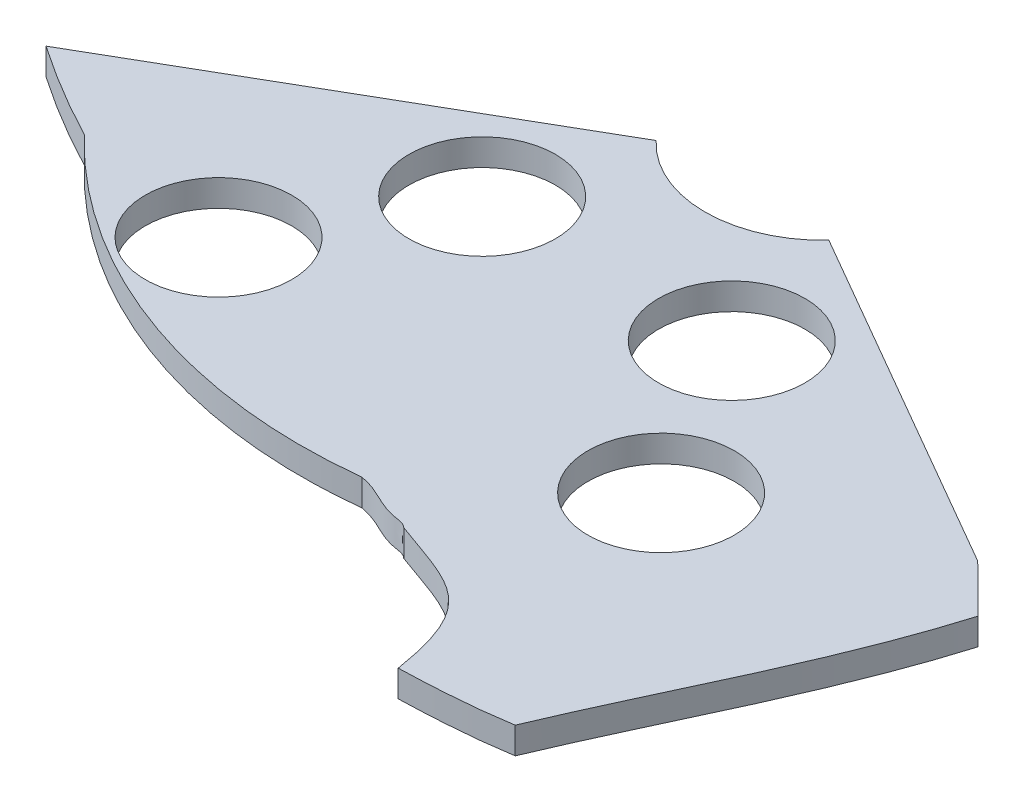
ISO-10303-21;
HEADER;
FILE_DESCRIPTION(('STEP AP214'),'2;1');
FILE_NAME('part.step','',(''),(''),'','','');
FILE_SCHEMA(('AUTOMOTIVE_DESIGN { 1 0 10303 214 1 1 1 1 }'));
ENDSEC;
DATA;
#1=APPLICATION_CONTEXT('core data for automotive mechanical design processes');
#2=APPLICATION_PROTOCOL_DEFINITION('international standard','automotive_design',2000,#1);
#3=PRODUCT_CONTEXT('',#1,'mechanical');
#4=PRODUCT('Part','Part','',(#3));
#5=PRODUCT_RELATED_PRODUCT_CATEGORY('part','',(#4));
#6=PRODUCT_DEFINITION_FORMATION('','',#4);
#7=PRODUCT_DEFINITION_CONTEXT('part definition',#1,'design');
#8=PRODUCT_DEFINITION('design','',#6,#7);
#9=PRODUCT_DEFINITION_SHAPE('','',#8);
#10=(LENGTH_UNIT() NAMED_UNIT(*) SI_UNIT(.MILLI.,.METRE.));
#11=(NAMED_UNIT(*) PLANE_ANGLE_UNIT() SI_UNIT($,.RADIAN.));
#12=(NAMED_UNIT(*) SI_UNIT($,.STERADIAN.) SOLID_ANGLE_UNIT());
#13=UNCERTAINTY_MEASURE_WITH_UNIT(LENGTH_MEASURE(1.E-05),#10,'distance_accuracy_value','');
#14=(GEOMETRIC_REPRESENTATION_CONTEXT(3) GLOBAL_UNCERTAINTY_ASSIGNED_CONTEXT((#13)) GLOBAL_UNIT_ASSIGNED_CONTEXT((#10,
#11,#12)) REPRESENTATION_CONTEXT('',''));
#15=CARTESIAN_POINT('',(0.,0.,0.));
#16=DIRECTION('',(0.,0.,1.));
#17=DIRECTION('',(1.,0.,0.));
#18=AXIS2_PLACEMENT_3D('',#15,#16,#17);
#19=CARTESIAN_POINT('',(31.0922457729686,-51.7359999999999,87.3476547842858));
#20=DIRECTION('',(0.,-1.,0.));
#21=DIRECTION('',(0.,0.,-1.));
#22=AXIS2_PLACEMENT_3D('',#19,#20,#21);
#23=PLANE('',#22);
#24=CARTESIAN_POINT('',(18.75,-51.7359999999999,32.476));
#25=DIRECTION('',(0.,-1.,0.));
#26=DIRECTION('',(0.,0.,-1.));
#27=AXIS2_PLACEMENT_3D('',#24,#25,#26);
#28=CIRCLE('',#27,10.999845998306);
#29=CARTESIAN_POINT('',(18.75,-51.7359999999999,21.476154001694));
#30=VERTEX_POINT('',#29);
#31=EDGE_CURVE('E322',#30,#30,#28,.T.);
#32=ORIENTED_EDGE('',*,*,#31,.F.);
#33=EDGE_LOOP('',(#32));
#34=FACE_BOUND('',#33,.T.);
#35=CARTESIAN_POINT('',(-33.25,-51.7359999999999,57.591));
#36=DIRECTION('',(0.,-1.,0.));
#37=DIRECTION('',(0.,0.,-1.));
#38=AXIS2_PLACEMENT_3D('',#35,#36,#37);
#39=CIRCLE('',#38,10.999845998306);
#40=CARTESIAN_POINT('',(-33.25,-51.7359999999999,46.591154001694));
#41=VERTEX_POINT('',#40);
#42=EDGE_CURVE('E314',#41,#41,#39,.T.);
#43=ORIENTED_EDGE('',*,*,#42,.F.);
#44=EDGE_LOOP('',(#43));
#45=FACE_BOUND('',#44,.T.);
#46=CARTESIAN_POINT('',(36.3034214605919,-51.7359999999999,100.14232315791));
#47=CARTESIAN_POINT('',(36.2722423066304,-51.7359999999999,99.9483205499946));
#48=CARTESIAN_POINT('',(36.2105658958696,-51.7359999999999,99.5645613777007));
#49=CARTESIAN_POINT('',(36.0083837780172,-51.7359999999999,98.3898205169901));
#50=CARTESIAN_POINT('',(35.6770431923336,-51.7359999999999,96.707163576821));
#51=CARTESIAN_POINT('',(35.1137065353659,-51.7359999999999,94.4884111173811));
#52=CARTESIAN_POINT('',(34.3991635457918,-51.7359999999999,92.3553166948788));
#53=CARTESIAN_POINT('',(33.4308209072164,-51.7359999999999,90.2705106817363));
#54=CARTESIAN_POINT('',(32.1463765320212,-51.7359999999999,88.3629128291031));
#55=CARTESIAN_POINT('',(30.5140316793366,-51.7359999999999,86.7428527947483));
#56=CARTESIAN_POINT('',(28.6106948029034,-51.7359999999999,85.457786972927));
#57=CARTESIAN_POINT('',(26.5545713707859,-51.7359999999999,84.4412777514571));
#58=CARTESIAN_POINT('',(24.4224491105649,-51.7359999999999,83.5889587583609));
#59=CARTESIAN_POINT('',(22.2620287193661,-51.7359999999999,82.8176754103132));
#60=CARTESIAN_POINT('',(20.457050477601,-51.7359999999999,82.1867793534183));
#61=CARTESIAN_POINT('',(19.1831693542021,-51.7359999999999,81.7237977883399));
#62=CARTESIAN_POINT('',(18.6303392296245,-51.7359999999999,81.5165568836755));
#63=CARTESIAN_POINT('',(18.435824488241,-51.7359999999999,81.4427512865197));
#64=B_SPLINE_CURVE_WITH_KNOTS('',3,(#46,#47,#48,#49,#50,#51,#52,#53,#54,#55,#56,#57,#58,#59,#60,
#61,#62,#63),.UNSPECIFIED.,.F.,.F.,(4,1,1,1,1,1,1,1,1,1,1,1,1,1,1,4),(4.52192588767721E-06,
0.0197025323041202,0.038969430002093,0.119503047716372,0.191555259014688,0.268326395744094,
0.344708504474092,0.421335847826775,0.497602445078151,0.573720249796047,0.65053285754585,
0.727138927454548,0.803802413164401,0.880491835509347,0.91882158195477,0.93967791805626),.UNSPECIFIED.);
#65=CARTESIAN_POINT('',(36.3034214605923,-51.7359999999999,100.14232315791));
#66=VERTEX_POINT('',#65);
#67=CARTESIAN_POINT('',(18.4358244882411,-51.7359999999999,81.4427512865198));
#68=VERTEX_POINT('',#67);
#69=EDGE_CURVE('E287',#66,#68,#64,.T.);
#70=ORIENTED_EDGE('',*,*,#69,.T.);
#71=CARTESIAN_POINT('',(8.71445021344893,-51.7359999999999,78.0146843463536));
#72=CARTESIAN_POINT('',(8.79827914550311,-51.7359999999999,78.0301675069417));
#73=CARTESIAN_POINT('',(8.95634314147588,-51.7359999999999,78.0593624628421));
#74=CARTESIAN_POINT('',(9.29075497645023,-51.7359999999999,78.1290079610875));
#75=CARTESIAN_POINT('',(9.89025772305813,-51.7359999999999,78.2730709088307));
#76=CARTESIAN_POINT('',(10.751353643638,-51.7359999999999,78.5437547626284));
#77=CARTESIAN_POINT('',(11.75280559272,-51.7359999999999,78.9564349414141));
#78=CARTESIAN_POINT('',(12.7307890659523,-51.7359999999999,79.4237027060885));
#79=CARTESIAN_POINT('',(13.708482699243,-51.7359999999999,79.8906777344824));
#80=CARTESIAN_POINT('',(14.7106310650652,-51.7359999999999,80.2994586927879));
#81=CARTESIAN_POINT('',(15.5750055125626,-51.7359999999999,80.5577989766006));
#82=CARTESIAN_POINT('',(16.1782810221549,-51.7359999999999,80.6858035266824));
#83=CARTESIAN_POINT('',(17.0931643543869,-51.7359999999999,80.8447107456617));
#84=CARTESIAN_POINT('',(17.8449131162641,-51.7359999999999,80.8770127004184));
#85=CARTESIAN_POINT('',(18.4358244882411,-51.7359999999999,81.4427512865198));
#86=B_SPLINE_CURVE_WITH_KNOTS('',3,(#71,#72,#73,#74,#75,#76,#77,#78,#79,#80,#81,#82,#83,#84,
#85),.UNSPECIFIED.,.F.,.F.,(4,1,1,1,1,1,1,1,1,1,1,1,4),(-0.464839946995523,-0.434890842030549,
-0.408369244543523,-0.344837650759817,-0.218331423154126,-0.0917261299140938,0.0353710766726976,
0.162442892637417,0.288910259376257,0.415229205522858,0.478754972127489,0.505487119494974,
0.741435522129088),.UNSPECIFIED.);
#87=CARTESIAN_POINT('',(8.71445021344893,-51.7359999999999,78.0146843463536));
#88=VERTEX_POINT('',#87);
#89=EDGE_CURVE('E110',#68,#88,#86,.F.);
#90=ORIENTED_EDGE('',*,*,#89,.T.);
#91=CARTESIAN_POINT('',(-56.6885032909574,-51.7359999999999,54.3012433729298));
#92=CARTESIAN_POINT('',(-54.6107720779797,-51.7359999999999,56.4701165511445));
#93=CARTESIAN_POINT('',(-52.4088311265118,-51.7359999999999,58.5200613000167));
#94=CARTESIAN_POINT('',(-47.7856896918463,-51.7359999999999,62.352599834194));
#95=CARTESIAN_POINT('',(-45.3631619708741,-51.7359999999999,64.1361339731961));
#96=CARTESIAN_POINT('',(-40.3301763633571,-51.7359999999999,67.4148022908917));
#97=CARTESIAN_POINT('',(-37.7202487687362,-51.7359999999999,68.9095621329314));
#98=CARTESIAN_POINT('',(-32.345670732517,-51.7359999999999,71.589074145135));
#99=CARTESIAN_POINT('',(-29.579684318261,-51.7359999999999,72.7756203612794));
#100=CARTESIAN_POINT('',(-21.1116124523366,-51.7359999999999,75.8468666180957));
#101=CARTESIAN_POINT('',(-15.2279360152211,-51.7359999999999,77.2425612154279));
#102=CARTESIAN_POINT('',(-3.30085828951529,-51.7359999999999,78.6595613265935));
#103=CARTESIAN_POINT('',(2.74588394821245,-51.7359999999999,78.6817859785756));
#104=CARTESIAN_POINT('',(8.71445021344842,-51.7359999999999,78.0146843463536));
#105=B_SPLINE_CURVE_WITH_KNOTS('',3,(#91,#92,#93,#94,#95,#96,#97,#98,#99,#100,#101,#102,#103,
#104),.UNSPECIFIED.,.F.,.F.,(4,2,2,2,2,2,4),(1.77571858528403E-06,0.125001501144737,
0.250001501144737,0.375001501144737,0.500001501144737,0.750001501144737,0.999999725426152),.UNSPECIFIED.);
#106=CARTESIAN_POINT('',(-56.6885032909577,-51.7359999999999,54.3012433729301));
#107=VERTEX_POINT('',#106);
#108=EDGE_CURVE('E523',#88,#107,#105,.F.);
#109=ORIENTED_EDGE('',*,*,#108,.T.);
#110=CARTESIAN_POINT('',(-71.0939787072232,-51.7359999999999,45.6649885713721));
#111=CARTESIAN_POINT('',(-70.808361941889,-51.7359999999999,45.8598104700658));
#112=CARTESIAN_POINT('',(-70.2341173275871,-51.7359999999999,46.2515081560961));
#113=CARTESIAN_POINT('',(-69.3626917316103,-51.7359999999999,46.8340398620582));
#114=CARTESIAN_POINT('',(-68.477953062501,-51.7359999999999,47.4165637276122));
#115=CARTESIAN_POINT('',(-67.5792499402748,-51.7359999999999,47.9983208101176));
#116=CARTESIAN_POINT('',(-66.6664170827351,-51.7359999999999,48.5792864915986));
#117=CARTESIAN_POINT('',(-65.7391327650371,-51.7359999999999,49.1592491184755));
#118=CARTESIAN_POINT('',(-64.7970750479408,-51.7359999999999,49.7380335280518));
#119=CARTESIAN_POINT('',(-63.8398922815515,-51.7359999999999,50.3154554595542));
#120=CARTESIAN_POINT('',(-62.8672259995605,-51.7359999999999,50.8913399332979));
#121=CARTESIAN_POINT('',(-61.8787114068616,-51.7359999999999,51.4655194173332));
#122=CARTESIAN_POINT('',(-60.8739649738774,-51.7359999999999,52.0378127758029));
#123=CARTESIAN_POINT('',(-59.8526315117153,-51.7359999999999,52.6081173509569));
#124=CARTESIAN_POINT('',(-58.8142015406374,-51.7359999999999,53.1760557189396));
#125=CARTESIAN_POINT('',(-57.7587057624524,-51.7359999999999,53.7423117683221));
#126=CARTESIAN_POINT('',(-57.0466726445727,-51.7359999999999,54.1141832820878));
#127=CARTESIAN_POINT('',(-56.6885032909577,-51.7359999999999,54.3012433729301));
#128=B_SPLINE_CURVE_WITH_KNOTS('',3,(#110,#111,#112,#113,#114,#115,#116,#117,#118,#119,#120,
#121,#122,#123,#124,#125,#126,#127),.UNSPECIFIED.,.F.,.F.,(4,1,1,1,1,1,1,1,1,1,1,1,1,1,1,4),(0.,
0.0617147511157611,0.124080123271925,0.187105475832416,0.250800927613021,0.315178138175983,
0.380249907699065,0.446031380989377,0.512539116952251,0.579790456502962,0.647803539788843,
0.716597523199285,0.786192621119076,0.856609930865377,0.927871433101755,1.),.UNSPECIFIED.);
#129=CARTESIAN_POINT('',(-71.0939787072232,-51.7359999999999,45.6649885713721));
#130=VERTEX_POINT('',#129);
#131=EDGE_CURVE('E572',#107,#130,#128,.F.);
#132=ORIENTED_EDGE('',*,*,#131,.T.);
#133=DIRECTION('',(0.866024521520465,0.,-0.500001528122914));
#134=VECTOR('',#133,1.);
#135=CARTESIAN_POINT('',(-71.0939787072232,-51.7359999999999,45.6649885713721));
#136=LINE('',#135,#134);
#137=CARTESIAN_POINT('',(-69.4472727137027,-51.7359999999999,44.7142585485272));
#138=VERTEX_POINT('',#137);
#139=EDGE_CURVE('E198',#130,#138,#136,.T.);
#140=ORIENTED_EDGE('',*,*,#139,.T.);
#141=DIRECTION('',(0.866025116884805,0.,-0.500000496924413));
#142=VECTOR('',#141,1.);
#143=CARTESIAN_POINT('',(-69.4472727137027,-51.7359999999999,44.7142585485272));
#144=LINE('',#143,#142);
#145=CARTESIAN_POINT('',(-12.9766531358799,-51.7359999999999,12.1108879302399));
#146=VERTEX_POINT('',#145);
#147=EDGE_CURVE('E196',#138,#146,#144,.T.);
#148=ORIENTED_EDGE('',*,*,#147,.T.);
#149=CARTESIAN_POINT('',(0.,-51.7359999999999,0.));
#150=DIRECTION('',(0.,1.,0.));
#151=DIRECTION('',(0.,0.,-1.));
#152=AXIS2_PLACEMENT_3D('',#149,#150,#151);
#153=CIRCLE('',#152,17.7501305084715);
#154=CARTESIAN_POINT('',(12.9766531358511,-51.7359999999999,12.1108879302707));
#155=VERTEX_POINT('',#154);
#156=EDGE_CURVE('E194',#146,#155,#153,.T.);
#157=ORIENTED_EDGE('',*,*,#156,.T.);
#158=DIRECTION('',(0.866025113442762,0.,0.500000502886198));
#159=VECTOR('',#158,1.);
#160=CARTESIAN_POINT('',(12.9766531358511,-51.7359999999999,12.1108879302707));
#161=LINE('',#160,#159);
#162=CARTESIAN_POINT('',(65.8946490574716,-51.7359999999999,42.6631480920527));
#163=VERTEX_POINT('',#162);
#164=EDGE_CURVE('E192',#155,#163,#161,.T.);
#165=ORIENTED_EDGE('',*,*,#164,.T.);
#166=DIRECTION('',(0.709056569507976,0.,0.705151601598962));
#167=VECTOR('',#166,1.);
#168=CARTESIAN_POINT('',(65.8946490574716,-51.7359999999999,42.6631480920527));
#169=LINE('',#168,#167);
#170=CARTESIAN_POINT('',(73.0898117322734,-51.7359999999999,49.8186850436703));
#171=VERTEX_POINT('',#170);
#172=EDGE_CURVE('E187',#163,#171,#169,.T.);
#173=ORIENTED_EDGE('',*,*,#172,.T.);
#174=CARTESIAN_POINT('',(73.0898117322734,-51.7359999999999,49.8186850436703));
#175=CARTESIAN_POINT('',(72.9995851762111,-51.7359999999999,50.1168286806181));
#176=CARTESIAN_POINT('',(72.8190803279566,-51.7359999999999,50.7132869108107));
#177=CARTESIAN_POINT('',(72.1216011052908,-51.7359999999999,52.9478799743153));
#178=CARTESIAN_POINT('',(70.9201269559049,-51.7359999999999,56.5261241546785));
#179=CARTESIAN_POINT('',(69.1137849475002,-51.7359999999999,61.3685818516271));
#180=CARTESIAN_POINT('',(67.1636133866402,-51.7359999999999,66.1894292032001));
#181=CARTESIAN_POINT('',(64.4302681060821,-51.7359999999999,72.5380354600836));
#182=CARTESIAN_POINT('',(61.5331876497874,-51.7359999999999,78.8388616849797));
#183=CARTESIAN_POINT('',(58.6112504613741,-51.7359999999999,85.1034462711001));
#184=CARTESIAN_POINT('',(56.8071752424675,-51.7359999999999,89.0046441203389));
#185=CARTESIAN_POINT('',(55.3809367893805,-51.7359999999999,92.1527072396865));
#186=CARTESIAN_POINT('',(54.381141087478,-51.7359999999999,94.4019260545319));
#187=CARTESIAN_POINT('',(53.4149388077412,-51.7359999999999,96.6206201732798));
#188=CARTESIAN_POINT('',(52.8191880334789,-51.7359999999999,98.0337412153336));
#189=CARTESIAN_POINT('',(52.5084097915571,-51.7359999999999,98.7709073123747));
#190=B_SPLINE_CURVE_WITH_KNOTS('',3,(#174,#175,#176,#177,#178,#179,#180,#181,#182,#183,#184,
#185,#186,#187,#188,#189),.UNSPECIFIED.,.F.,.F.,(4,1,1,1,1,1,1,1,1,1,1,1,1,4),(0.,
0.0175839803164747,0.035178043330654,0.132144184615272,0.230609538977804,0.326891123194742,
0.425676409663998,0.62076816580397,0.718335723614617,0.815893978787788,0.863395972446389,
0.913430538067761,0.954840335345387,1.),.UNSPECIFIED.);
#191=CARTESIAN_POINT('',(52.5084715971212,-51.7359999999999,98.7707607095553));
#192=VERTEX_POINT('',#191);
#193=EDGE_CURVE('E145',#171,#192,#190,.T.);
#194=ORIENTED_EDGE('',*,*,#193,.T.);
#195=DIRECTION('',(-0.776801217312848,0.,0.62974587635115));
#196=VECTOR('',#195,1.);
#197=CARTESIAN_POINT('',(52.508260648247,-51.7359999999999,98.7709317239418));
#198=LINE('',#197,#196);
#199=CARTESIAN_POINT('',(52.5082606482603,-51.7359999999999,98.7709317239369));
#200=VERTEX_POINT('',#199);
#201=EDGE_CURVE('E139',#192,#200,#198,.T.);
#202=ORIENTED_EDGE('',*,*,#201,.T.);
#203=CARTESIAN_POINT('',(52.5083976237453,-51.7359999999999,98.7709093039804));
#204=CARTESIAN_POINT('',(47.5723301483943,-51.7359999999999,99.5788425390305));
#205=CARTESIAN_POINT('',(42.1368924010279,-51.7359999999999,99.9723999671081));
#206=CARTESIAN_POINT('',(36.303425381382,-51.7359999999999,100.142457274423));
#207=B_SPLINE_CURVE_WITH_KNOTS('',3,(#203,#204,#205,#206),.UNSPECIFIED.,.F.,.F.,(4,4),(0.,1.),.UNSPECIFIED.);
#208=CARTESIAN_POINT('',(36.3035397092082,-51.7359999999999,100.142453941509));
#209=VERTEX_POINT('',#208);
#210=EDGE_CURVE('E143',#200,#209,#207,.T.);
#211=ORIENTED_EDGE('',*,*,#210,.T.);
#212=DIRECTION('',(-0.670665654072,0.,-0.741759786216654));
#213=VECTOR('',#212,1.);
#214=CARTESIAN_POINT('',(36.3034214605923,-51.7359999999999,100.14232315791));
#215=LINE('',#214,#213);
#216=EDGE_CURVE('E52',#209,#66,#215,.T.);
#217=ORIENTED_EDGE('',*,*,#216,.T.);
#218=EDGE_LOOP('',(#70,#90,#109,#132,#140,#148,#157,#165,#173,#194,#202,#211,#217));
#219=FACE_BOUND('',#218,.T.);
#220=CARTESIAN_POINT('',(33.25,-51.7359999999999,57.591));
#221=DIRECTION('',(0.,-1.,0.));
#222=DIRECTION('',(0.,0.,-1.));
#223=AXIS2_PLACEMENT_3D('',#220,#221,#222);
#224=CIRCLE('',#223,10.999845998306);
#225=CARTESIAN_POINT('',(33.25,-51.7359999999999,46.591154001694));
#226=VERTEX_POINT('',#225);
#227=EDGE_CURVE('E315',#226,#226,#224,.T.);
#228=ORIENTED_EDGE('',*,*,#227,.F.);
#229=EDGE_LOOP('',(#228));
#230=FACE_BOUND('',#229,.T.);
#231=CARTESIAN_POINT('',(-18.75,-51.7359999999999,32.476));
#232=DIRECTION('',(0.,-1.,0.));
#233=DIRECTION('',(0.,0.,-1.));
#234=AXIS2_PLACEMENT_3D('',#231,#232,#233);
#235=CIRCLE('',#234,10.999845998306);
#236=CARTESIAN_POINT('',(-18.75,-51.7359999999999,21.476154001694));
#237=VERTEX_POINT('',#236);
#238=EDGE_CURVE('E328',#237,#237,#235,.T.);
#239=ORIENTED_EDGE('',*,*,#238,.F.);
#240=EDGE_LOOP('',(#239));
#241=FACE_BOUND('',#240,.T.);
#242=ADVANCED_FACE('F30',(#34,#45,#219,#230,#241),#23,.T.);
#243=CARTESIAN_POINT('',(31.0922457729686,-47.7359999999999,87.3476547842858));
#244=DIRECTION('',(0.,-1.,0.));
#245=DIRECTION('',(0.,0.,-1.));
#246=AXIS2_PLACEMENT_3D('',#243,#244,#245);
#247=PLANE('',#246);
#248=CARTESIAN_POINT('',(18.75,-47.7359999999999,32.476));
#249=DIRECTION('',(0.,-1.,0.));
#250=DIRECTION('',(0.,0.,-1.));
#251=AXIS2_PLACEMENT_3D('',#248,#249,#250);
#252=CIRCLE('',#251,10.999845998306);
#253=CARTESIAN_POINT('',(18.75,-47.7359999999999,21.476154001694));
#254=VERTEX_POINT('',#253);
#255=EDGE_CURVE('E325',#254,#254,#252,.T.);
#256=ORIENTED_EDGE('',*,*,#255,.T.);
#257=EDGE_LOOP('',(#256));
#258=FACE_BOUND('',#257,.T.);
#259=CARTESIAN_POINT('',(-33.25,-47.7359999999999,57.591));
#260=DIRECTION('',(0.,-1.,0.));
#261=DIRECTION('',(0.,0.,-1.));
#262=AXIS2_PLACEMENT_3D('',#259,#260,#261);
#263=CIRCLE('',#262,10.999845998306);
#264=CARTESIAN_POINT('',(-33.25,-47.7359999999999,46.591154001694));
#265=VERTEX_POINT('',#264);
#266=EDGE_CURVE('E307',#265,#265,#263,.T.);
#267=ORIENTED_EDGE('',*,*,#266,.T.);
#268=EDGE_LOOP('',(#267));
#269=FACE_BOUND('',#268,.T.);
#270=CARTESIAN_POINT('',(36.3034214605919,-47.7359999999999,100.14232315791));
#271=CARTESIAN_POINT('',(36.2722423066304,-47.7359999999999,99.9483205499946));
#272=CARTESIAN_POINT('',(36.2105658958696,-47.7359999999999,99.5645613777007));
#273=CARTESIAN_POINT('',(36.0083837780172,-47.7359999999999,98.3898205169901));
#274=CARTESIAN_POINT('',(35.6770431923336,-47.7359999999999,96.707163576821));
#275=CARTESIAN_POINT('',(35.1137065353659,-47.7359999999999,94.4884111173811));
#276=CARTESIAN_POINT('',(34.3991635457918,-47.7359999999999,92.3553166948788));
#277=CARTESIAN_POINT('',(33.4308209072164,-47.7359999999999,90.2705106817363));
#278=CARTESIAN_POINT('',(32.1463765320212,-47.7359999999999,88.3629128291031));
#279=CARTESIAN_POINT('',(30.5140316793366,-47.7359999999999,86.7428527947483));
#280=CARTESIAN_POINT('',(28.6106948029034,-47.7359999999999,85.457786972927));
#281=CARTESIAN_POINT('',(26.5545713707859,-47.7359999999999,84.4412777514571));
#282=CARTESIAN_POINT('',(24.4224491105649,-47.7359999999999,83.5889587583609));
#283=CARTESIAN_POINT('',(22.2620287193661,-47.7359999999999,82.8176754103132));
#284=CARTESIAN_POINT('',(20.457050477601,-47.7359999999999,82.1867793534183));
#285=CARTESIAN_POINT('',(19.1831693542021,-47.7359999999999,81.7237977883399));
#286=CARTESIAN_POINT('',(18.6303392296245,-47.7359999999999,81.5165568836755));
#287=CARTESIAN_POINT('',(18.435824488241,-47.7359999999999,81.4427512865197));
#288=B_SPLINE_CURVE_WITH_KNOTS('',3,(#270,#271,#272,#273,#274,#275,#276,#277,#278,#279,#280,
#281,#282,#283,#284,#285,#286,#287),.UNSPECIFIED.,.F.,.F.,(4,1,1,1,1,1,1,1,1,1,1,1,1,1,1,4),
(4.52192588767721E-06,0.0197025323041202,0.038969430002093,0.119503047716372,0.191555259014688,
0.268326395744094,0.344708504474092,0.421335847826775,0.497602445078151,0.573720249796047,
0.65053285754585,0.727138927454548,0.803802413164401,0.880491835509347,0.91882158195477,
0.93967791805626),.UNSPECIFIED.);
#289=CARTESIAN_POINT('',(36.3034214605923,-47.7359999999999,100.14232315791));
#290=VERTEX_POINT('',#289);
#291=CARTESIAN_POINT('',(18.4358244882411,-47.7359999999999,81.4427512865198));
#292=VERTEX_POINT('',#291);
#293=EDGE_CURVE('E318',#290,#292,#288,.T.);
#294=ORIENTED_EDGE('',*,*,#293,.F.);
#295=DIRECTION('',(-0.670665654072,0.,-0.741759786216654));
#296=VECTOR('',#295,1.);
#297=CARTESIAN_POINT('',(36.3034214605923,-47.7359999999999,100.14232315791));
#298=LINE('',#297,#296);
#299=CARTESIAN_POINT('',(36.3035397092082,-47.7359999999999,100.142453941509));
#300=VERTEX_POINT('',#299);
#301=EDGE_CURVE('E102',#300,#290,#298,.T.);
#302=ORIENTED_EDGE('',*,*,#301,.F.);
#303=CARTESIAN_POINT('',(52.5083976237453,-47.7359999999999,98.7709093039804));
#304=CARTESIAN_POINT('',(47.5723301483943,-47.7359999999999,99.5788425390305));
#305=CARTESIAN_POINT('',(42.1368924010279,-47.7359999999999,99.9723999671081));
#306=CARTESIAN_POINT('',(36.303425381382,-47.7359999999999,100.142457274423));
#307=B_SPLINE_CURVE_WITH_KNOTS('',3,(#303,#304,#305,#306),.UNSPECIFIED.,.F.,.F.,(4,4),(0.,1.),.UNSPECIFIED.);
#308=CARTESIAN_POINT('',(52.5082606482603,-47.7359999999999,98.7709317239369));
#309=VERTEX_POINT('',#308);
#310=EDGE_CURVE('E96',#309,#300,#307,.T.);
#311=ORIENTED_EDGE('',*,*,#310,.F.);
#312=DIRECTION('',(-0.776801217312848,0.,0.62974587635115));
#313=VECTOR('',#312,1.);
#314=CARTESIAN_POINT('',(52.508260648247,-47.7359999999999,98.7709317239418));
#315=LINE('',#314,#313);
#316=CARTESIAN_POINT('',(52.5084715971212,-47.7359999999999,98.7707607095553));
#317=VERTEX_POINT('',#316);
#318=EDGE_CURVE('E153',#317,#309,#315,.T.);
#319=ORIENTED_EDGE('',*,*,#318,.F.);
#320=CARTESIAN_POINT('',(73.0898117322734,-47.7359999999999,49.8186850436703));
#321=CARTESIAN_POINT('',(72.9995851762111,-47.7359999999999,50.1168286806181));
#322=CARTESIAN_POINT('',(72.8190803279566,-47.7359999999999,50.7132869108107));
#323=CARTESIAN_POINT('',(72.1216011052908,-47.7359999999999,52.9478799743153));
#324=CARTESIAN_POINT('',(70.9201269559049,-47.7359999999999,56.5261241546785));
#325=CARTESIAN_POINT('',(69.1137849475002,-47.7359999999999,61.3685818516271));
#326=CARTESIAN_POINT('',(67.1636133866402,-47.7359999999999,66.1894292032001));
#327=CARTESIAN_POINT('',(64.4302681060821,-47.7359999999999,72.5380354600836));
#328=CARTESIAN_POINT('',(61.5331876497874,-47.7359999999999,78.8388616849797));
#329=CARTESIAN_POINT('',(58.6112504613741,-47.7359999999999,85.1034462711001));
#330=CARTESIAN_POINT('',(56.8071752424675,-47.7359999999999,89.0046441203389));
#331=CARTESIAN_POINT('',(55.3809367893805,-47.7359999999999,92.1527072396865));
#332=CARTESIAN_POINT('',(54.381141087478,-47.7359999999999,94.4019260545319));
#333=CARTESIAN_POINT('',(53.4149388077412,-47.7359999999999,96.6206201732798));
#334=CARTESIAN_POINT('',(52.8191880334789,-47.7359999999999,98.0337412153336));
#335=CARTESIAN_POINT('',(52.5084097915571,-47.7359999999999,98.7709073123747));
#336=B_SPLINE_CURVE_WITH_KNOTS('',3,(#320,#321,#322,#323,#324,#325,#326,#327,#328,#329,#330,
#331,#332,#333,#334,#335),.UNSPECIFIED.,.F.,.F.,(4,1,1,1,1,1,1,1,1,1,1,1,1,4),(0.,
0.0175839803164747,0.035178043330654,0.132144184615272,0.230609538977804,0.326891123194742,
0.425676409663998,0.62076816580397,0.718335723614617,0.815893978787788,0.863395972446389,
0.913430538067761,0.954840335345387,1.),.UNSPECIFIED.);
#337=CARTESIAN_POINT('',(73.0898117322734,-47.7359999999999,49.8186850436703));
#338=VERTEX_POINT('',#337);
#339=EDGE_CURVE('E540',#338,#317,#336,.T.);
#340=ORIENTED_EDGE('',*,*,#339,.F.);
#341=DIRECTION('',(0.709056569507976,0.,0.705151601598962));
#342=VECTOR('',#341,1.);
#343=CARTESIAN_POINT('',(65.8946490574716,-47.7359999999999,42.6631480920527));
#344=LINE('',#343,#342);
#345=CARTESIAN_POINT('',(65.8946490574716,-47.7359999999999,42.6631480920527));
#346=VERTEX_POINT('',#345);
#347=EDGE_CURVE('E538',#346,#338,#344,.T.);
#348=ORIENTED_EDGE('',*,*,#347,.F.);
#349=DIRECTION('',(0.866025113442762,0.,0.500000502886198));
#350=VECTOR('',#349,1.);
#351=CARTESIAN_POINT('',(12.9766531358511,-47.7359999999999,12.1108879302707));
#352=LINE('',#351,#350);
#353=CARTESIAN_POINT('',(12.9766531358511,-47.7359999999999,12.1108879302707));
#354=VERTEX_POINT('',#353);
#355=EDGE_CURVE('E534',#354,#346,#352,.T.);
#356=ORIENTED_EDGE('',*,*,#355,.F.);
#357=CARTESIAN_POINT('',(0.,-47.7359999999999,0.));
#358=DIRECTION('',(0.,1.,0.));
#359=DIRECTION('',(0.,0.,-1.));
#360=AXIS2_PLACEMENT_3D('',#357,#358,#359);
#361=CIRCLE('',#360,17.7501305084715);
#362=CARTESIAN_POINT('',(-12.9766531358799,-47.7359999999999,12.1108879302399));
#363=VERTEX_POINT('',#362);
#364=EDGE_CURVE('E531',#363,#354,#361,.T.);
#365=ORIENTED_EDGE('',*,*,#364,.F.);
#366=DIRECTION('',(0.866025116884805,0.,-0.500000496924413));
#367=VECTOR('',#366,1.);
#368=CARTESIAN_POINT('',(-69.4472727137027,-47.7359999999999,44.7142585485272));
#369=LINE('',#368,#367);
#370=CARTESIAN_POINT('',(-69.4472727137027,-47.7359999999999,44.7142585485272));
#371=VERTEX_POINT('',#370);
#372=EDGE_CURVE('E529',#371,#363,#369,.T.);
#373=ORIENTED_EDGE('',*,*,#372,.F.);
#374=DIRECTION('',(0.866024521520465,0.,-0.500001528122914));
#375=VECTOR('',#374,1.);
#376=CARTESIAN_POINT('',(-71.0939787072232,-47.7359999999999,45.6649885713721));
#377=LINE('',#376,#375);
#378=CARTESIAN_POINT('',(-71.0939787072232,-47.7359999999999,45.6649885713721));
#379=VERTEX_POINT('',#378);
#380=EDGE_CURVE('E247',#379,#371,#377,.T.);
#381=ORIENTED_EDGE('',*,*,#380,.F.);
#382=CARTESIAN_POINT('',(-56.6885032909577,-47.7359999999999,54.3012433729301));
#383=CARTESIAN_POINT('',(-57.0466726445727,-47.7359999999999,54.1141832820878));
#384=CARTESIAN_POINT('',(-57.7587057624524,-47.7359999999999,53.7423117683221));
#385=CARTESIAN_POINT('',(-58.8142015406374,-47.7359999999999,53.1760557189396));
#386=CARTESIAN_POINT('',(-59.8526315117153,-47.7359999999999,52.6081173509569));
#387=CARTESIAN_POINT('',(-60.8739649738774,-47.7359999999999,52.0378127758029));
#388=CARTESIAN_POINT('',(-61.8787114068616,-47.7359999999999,51.4655194173332));
#389=CARTESIAN_POINT('',(-62.8672259995605,-47.7359999999999,50.8913399332979));
#390=CARTESIAN_POINT('',(-63.8398922815515,-47.7359999999999,50.3154554595542));
#391=CARTESIAN_POINT('',(-64.7970750479408,-47.7359999999999,49.7380335280518));
#392=CARTESIAN_POINT('',(-65.7391327650371,-47.7359999999999,49.1592491184755));
#393=CARTESIAN_POINT('',(-66.6664170827351,-47.7359999999999,48.5792864915986));
#394=CARTESIAN_POINT('',(-67.5792499402748,-47.7359999999999,47.9983208101176));
#395=CARTESIAN_POINT('',(-68.477953062501,-47.7359999999999,47.4165637276122));
#396=CARTESIAN_POINT('',(-69.3626917316103,-47.7359999999999,46.8340398620582));
#397=CARTESIAN_POINT('',(-70.2341173275871,-47.7359999999999,46.2515081560961));
#398=CARTESIAN_POINT('',(-70.808361941889,-47.7359999999999,45.8598104700658));
#399=CARTESIAN_POINT('',(-71.0939787072232,-47.7359999999999,45.6649885713721));
#400=B_SPLINE_CURVE_WITH_KNOTS('',3,(#382,#383,#384,#385,#386,#387,#388,#389,#390,#391,#392,
#393,#394,#395,#396,#397,#398,#399),.UNSPECIFIED.,.F.,.F.,(4,1,1,1,1,1,1,1,1,1,1,1,1,1,1,4),(0.,
0.0721285668982445,0.143390069134623,0.213807378880924,0.283402476800715,0.352196460211157,
0.420209543497038,0.487460883047749,0.553968619010623,0.619750092300935,0.684821861824017,
0.749199072386979,0.812894524167584,0.875919876728075,0.938285248884239,1.),.UNSPECIFIED.);
#401=CARTESIAN_POINT('',(-56.6885032909577,-47.7359999999999,54.3012433729301));
#402=VERTEX_POINT('',#401);
#403=EDGE_CURVE('E243',#402,#379,#400,.T.);
#404=ORIENTED_EDGE('',*,*,#403,.F.);
#405=CARTESIAN_POINT('',(8.71445021344842,-47.7359999999999,78.0146843463536));
#406=CARTESIAN_POINT('',(2.74588394821245,-47.7359999999999,78.6817859785756));
#407=CARTESIAN_POINT('',(-3.30085828951529,-47.7359999999999,78.6595613265935));
#408=CARTESIAN_POINT('',(-15.2279360152211,-47.7359999999999,77.2425612154279));
#409=CARTESIAN_POINT('',(-21.1116124523366,-47.7359999999999,75.8468666180957));
#410=CARTESIAN_POINT('',(-29.579684318261,-47.7359999999999,72.7756203612794));
#411=CARTESIAN_POINT('',(-32.345670732517,-47.7359999999999,71.589074145135));
#412=CARTESIAN_POINT('',(-37.7202487687362,-47.7359999999999,68.9095621329314));
#413=CARTESIAN_POINT('',(-40.3301763633571,-47.7359999999999,67.4148022908917));
#414=CARTESIAN_POINT('',(-45.3631619708741,-47.7359999999999,64.1361339731961));
#415=CARTESIAN_POINT('',(-47.7856896918463,-47.7359999999999,62.352599834194));
#416=CARTESIAN_POINT('',(-52.4088311265118,-47.7359999999999,58.5200613000167));
#417=CARTESIAN_POINT('',(-54.6107720779797,-47.7359999999999,56.4701165511445));
#418=CARTESIAN_POINT('',(-56.6885032909574,-47.7359999999999,54.3012433729298));
#419=B_SPLINE_CURVE_WITH_KNOTS('',3,(#405,#406,#407,#408,#409,#410,#411,#412,#413,#414,#415,
#416,#417,#418),.UNSPECIFIED.,.F.,.F.,(4,2,2,2,2,2,4),(1.77571858538395E-06,0.25,0.5,0.625,0.75,
0.875,0.999999725426152),.UNSPECIFIED.);
#420=CARTESIAN_POINT('',(8.71445021344893,-47.7359999999999,78.0146843463536));
#421=VERTEX_POINT('',#420);
#422=EDGE_CURVE('E498',#421,#402,#419,.T.);
#423=ORIENTED_EDGE('',*,*,#422,.F.);
#424=CARTESIAN_POINT('',(18.4358244882411,-47.7359999999999,81.4427512865198));
#425=CARTESIAN_POINT('',(17.8449131162641,-47.7359999999999,80.8770127004184));
#426=CARTESIAN_POINT('',(17.0931643543869,-47.7359999999999,80.8447107456617));
#427=CARTESIAN_POINT('',(16.1782810221549,-47.7359999999999,80.6858035266824));
#428=CARTESIAN_POINT('',(15.5750055125626,-47.7359999999999,80.5577989766006));
#429=CARTESIAN_POINT('',(14.7106310650652,-47.7359999999999,80.2994586927879));
#430=CARTESIAN_POINT('',(13.708482699243,-47.7359999999999,79.8906777344824));
#431=CARTESIAN_POINT('',(12.7307890659523,-47.7359999999999,79.4237027060885));
#432=CARTESIAN_POINT('',(11.75280559272,-47.7359999999999,78.9564349414141));
#433=CARTESIAN_POINT('',(10.751353643638,-47.7359999999999,78.5437547626284));
#434=CARTESIAN_POINT('',(9.89025772305813,-47.7359999999999,78.2730709088307));
#435=CARTESIAN_POINT('',(9.29075497645023,-47.7359999999999,78.1290079610875));
#436=CARTESIAN_POINT('',(8.95634314147588,-47.7359999999999,78.0593624628421));
#437=CARTESIAN_POINT('',(8.79827914550311,-47.7359999999999,78.0301675069417));
#438=CARTESIAN_POINT('',(8.71445021344893,-47.7359999999999,78.0146843463536));
#439=B_SPLINE_CURVE_WITH_KNOTS('',3,(#424,#425,#426,#427,#428,#429,#430,#431,#432,#433,#434,
#435,#436,#437,#438),.UNSPECIFIED.,.F.,.F.,(4,1,1,1,1,1,1,1,1,1,1,1,4),(-0.464839946995523,
-0.228891544361409,-0.202159396993924,-0.138633630389293,-0.0123146842426923,0.114152682496148,
0.241224498460868,0.368321705047659,0.494926998287691,0.621433225893382,0.684964819677088,
0.711486417164115,0.741435522129088),.UNSPECIFIED.);
#440=EDGE_CURVE('E497',#292,#421,#439,.T.);
#441=ORIENTED_EDGE('',*,*,#440,.F.);
#442=EDGE_LOOP('',(#294,#302,#311,#319,#340,#348,#356,#365,#373,#381,#404,#423,#441));
#443=FACE_BOUND('',#442,.T.);
#444=CARTESIAN_POINT('',(33.25,-47.7359999999999,57.591));
#445=DIRECTION('',(0.,-1.,0.));
#446=DIRECTION('',(0.,0.,-1.));
#447=AXIS2_PLACEMENT_3D('',#444,#445,#446);
#448=CIRCLE('',#447,10.999845998306);
#449=CARTESIAN_POINT('',(33.25,-47.7359999999999,46.591154001694));
#450=VERTEX_POINT('',#449);
#451=EDGE_CURVE('E319',#450,#450,#448,.T.);
#452=ORIENTED_EDGE('',*,*,#451,.T.);
#453=EDGE_LOOP('',(#452));
#454=FACE_BOUND('',#453,.T.);
#455=CARTESIAN_POINT('',(-18.75,-47.7359999999999,32.476));
#456=DIRECTION('',(0.,-1.,0.));
#457=DIRECTION('',(0.,0.,-1.));
#458=AXIS2_PLACEMENT_3D('',#455,#456,#457);
#459=CIRCLE('',#458,10.999845998306);
#460=CARTESIAN_POINT('',(-18.75,-47.7359999999999,21.476154001694));
#461=VERTEX_POINT('',#460);
#462=EDGE_CURVE('E331',#461,#461,#459,.T.);
#463=ORIENTED_EDGE('',*,*,#462,.T.);
#464=EDGE_LOOP('',(#463));
#465=FACE_BOUND('',#464,.T.);
#466=ADVANCED_FACE('F249',(#258,#269,#443,#454,#465),#247,.F.);
#467=DIRECTION('',(0.,1.,0.));
#468=VECTOR('',#467,1.);
#469=SURFACE_OF_LINEAR_EXTRUSION('',#64,#468);
#470=ORIENTED_EDGE('',*,*,#293,.T.);
#471=DIRECTION('',(0.,1.,0.));
#472=VECTOR('',#471,1.);
#473=CARTESIAN_POINT('',(18.4358244882411,-51.7359999999999,81.4427512865198));
#474=LINE('',#473,#472);
#475=EDGE_CURVE('E11',#68,#292,#474,.T.);
#476=ORIENTED_EDGE('',*,*,#475,.F.);
#477=ORIENTED_EDGE('',*,*,#69,.F.);
#478=DIRECTION('',(0.,1.,0.));
#479=VECTOR('',#478,1.);
#480=CARTESIAN_POINT('',(36.3034214605923,-51.7359999999999,100.14232315791));
#481=LINE('',#480,#479);
#482=EDGE_CURVE('E159',#66,#290,#481,.T.);
#483=ORIENTED_EDGE('',*,*,#482,.T.);
#484=EDGE_LOOP('',(#470,#476,#477,#483));
#485=FACE_BOUND('',#484,.T.);
#486=ADVANCED_FACE('F32',(#485),#469,.F.);
#487=CARTESIAN_POINT('',(-264.254839356023,-51.7359999999999,2060.836322531));
#488=CARTESIAN_POINT('',(38.9429983947745,-51.7359999999999,66.7924424118426));
#489=CARTESIAN_POINT('',(26.2848105611958,-51.7359999999999,82.441219158382));
#490=CARTESIAN_POINT('',(16.1782810221549,-51.7359999999999,80.6858035266824));
#491=CARTESIAN_POINT('',(15.5750055125626,-51.7359999999999,80.5577989766006));
#492=CARTESIAN_POINT('',(14.7106310650652,-51.7359999999999,80.2994586927879));
#493=CARTESIAN_POINT('',(13.708482699243,-51.7359999999999,79.8906777344824));
#494=CARTESIAN_POINT('',(12.7307890659523,-51.7359999999999,79.4237027060885));
#495=CARTESIAN_POINT('',(11.75280559272,-51.7359999999999,78.9564349414141));
#496=CARTESIAN_POINT('',(10.751353643638,-51.7359999999999,78.5437547626284));
#497=CARTESIAN_POINT('',(9.89025772305813,-51.7359999999999,78.2730709088307));
#498=CARTESIAN_POINT('',(9.29075497645023,-51.7359999999999,78.1290079610875));
#499=CARTESIAN_POINT('',(-1.47202815279934,-51.7359999999999,75.887522118935));
#500=CARTESIAN_POINT('',(-15.2089897305724,-51.7359999999999,89.876885389315));
#501=CARTESIAN_POINT('',(359.297267381621,-51.7359999999999,-1890.9012233659));
#502=B_SPLINE_CURVE_WITH_KNOTS('',3,(#487,#488,#489,#490,#491,#492,#493,#494,#495,#496,#497,
#498,#499,#500,#501),.UNSPECIFIED.,.F.,.F.,(4,1,1,1,1,1,1,1,1,1,1,1,4),(-3.74216826530237,
-0.228891544361409,-0.202159396993924,-0.138633630389293,-0.0123146842426923,0.114152682496148,
0.241224498460868,0.368321705047659,0.494926998287691,0.621433225893382,0.684964819677088,
0.711486417164115,4.48361319179072),.UNSPECIFIED.);
#503=DIRECTION('',(0.,1.,0.));
#504=VECTOR('',#503,1.);
#505=SURFACE_OF_LINEAR_EXTRUSION('',#502,#504);
#506=ORIENTED_EDGE('',*,*,#440,.T.);
#507=DIRECTION('',(0.,1.,0.));
#508=VECTOR('',#507,1.);
#509=CARTESIAN_POINT('',(8.71445021344893,-51.7359999999999,78.0146843463536));
#510=LINE('',#509,#508);
#511=EDGE_CURVE('E43',#88,#421,#510,.T.);
#512=ORIENTED_EDGE('',*,*,#511,.F.);
#513=ORIENTED_EDGE('',*,*,#89,.F.);
#514=ORIENTED_EDGE('',*,*,#475,.T.);
#515=EDGE_LOOP('',(#506,#512,#513,#514));
#516=FACE_BOUND('',#515,.T.);
#517=ADVANCED_FACE('F288',(#516),#505,.F.);
#518=CARTESIAN_POINT('',(8.7145773962685,-51.7359999999999,78.0146701311311));
#519=CARTESIAN_POINT('',(2.74596984732736,-51.7359999999999,78.6817862942611));
#520=CARTESIAN_POINT('',(-3.30081593109769,-51.7359999999999,78.6595663589982));
#521=CARTESIAN_POINT('',(-15.2279360152211,-51.7359999999999,77.2425612154279));
#522=CARTESIAN_POINT('',(-21.1116124523366,-51.7359999999999,75.8468666180957));
#523=CARTESIAN_POINT('',(-29.579684318261,-51.7359999999999,72.7756203612794));
#524=CARTESIAN_POINT('',(-32.345670732517,-51.7359999999999,71.589074145135));
#525=CARTESIAN_POINT('',(-37.7202487687362,-51.7359999999999,68.9095621329314));
#526=CARTESIAN_POINT('',(-40.3301763633571,-51.7359999999999,67.4148022908917));
#527=CARTESIAN_POINT('',(-45.3631619708741,-51.7359999999999,64.1361339731961));
#528=CARTESIAN_POINT('',(-47.7856896918463,-51.7359999999999,62.352599834194));
#529=CARTESIAN_POINT('',(-52.4088362040923,-51.7359999999999,58.5200570907527));
#530=CARTESIAN_POINT('',(-54.6107817515268,-51.7359999999999,56.4701075453446));
#531=CARTESIAN_POINT('',(-56.6885169827614,-51.7359999999999,54.3012290805162));
#532=B_SPLINE_CURVE_WITH_KNOTS('',3,(#518,#519,#520,#521,#522,#523,#524,#525,#526,#527,#528,
#529,#530,#531),.UNSPECIFIED.,.F.,.F.,(4,2,2,2,2,2,4),(0.,0.25,0.5,0.625,0.75,0.875,1.),.UNSPECIFIED.);
#533=DIRECTION('',(0.,1.,0.));
#534=VECTOR('',#533,1.);
#535=SURFACE_OF_LINEAR_EXTRUSION('',#532,#534);
#536=ORIENTED_EDGE('',*,*,#422,.T.);
#537=DIRECTION('',(0.,1.,0.));
#538=VECTOR('',#537,1.);
#539=CARTESIAN_POINT('',(-56.6885032909577,-51.7359999999999,54.3012433729301));
#540=LINE('',#539,#538);
#541=EDGE_CURVE('E525',#107,#402,#540,.T.);
#542=ORIENTED_EDGE('',*,*,#541,.F.);
#543=ORIENTED_EDGE('',*,*,#108,.F.);
#544=ORIENTED_EDGE('',*,*,#511,.T.);
#545=EDGE_LOOP('',(#536,#542,#543,#544));
#546=FACE_BOUND('',#545,.T.);
#547=ADVANCED_FACE('F217',(#546),#535,.F.);
#548=CARTESIAN_POINT('',(-56.6885032909577,-51.7359999999999,54.3012433729301));
#549=CARTESIAN_POINT('',(-57.0466726445727,-51.7359999999999,54.1141832820878));
#550=CARTESIAN_POINT('',(-57.7587057624524,-51.7359999999999,53.7423117683221));
#551=CARTESIAN_POINT('',(-58.8142015406374,-51.7359999999999,53.1760557189396));
#552=CARTESIAN_POINT('',(-59.8526315117153,-51.7359999999999,52.6081173509569));
#553=CARTESIAN_POINT('',(-60.8739649738774,-51.7359999999999,52.0378127758029));
#554=CARTESIAN_POINT('',(-61.8787114068616,-51.7359999999999,51.4655194173332));
#555=CARTESIAN_POINT('',(-62.8672259995605,-51.7359999999999,50.8913399332979));
#556=CARTESIAN_POINT('',(-63.8398922815515,-51.7359999999999,50.3154554595542));
#557=CARTESIAN_POINT('',(-64.7970750479408,-51.7359999999999,49.7380335280518));
#558=CARTESIAN_POINT('',(-65.7391327650371,-51.7359999999999,49.1592491184755));
#559=CARTESIAN_POINT('',(-66.6664170827351,-51.7359999999999,48.5792864915986));
#560=CARTESIAN_POINT('',(-67.5792499402748,-51.7359999999999,47.9983208101176));
#561=CARTESIAN_POINT('',(-68.477953062501,-51.7359999999999,47.4165637276122));
#562=CARTESIAN_POINT('',(-69.3626917316103,-51.7359999999999,46.8340398620582));
#563=CARTESIAN_POINT('',(-70.2341173275871,-51.7359999999999,46.2515081560961));
#564=CARTESIAN_POINT('',(-70.808361941889,-51.7359999999999,45.8598104700658));
#565=CARTESIAN_POINT('',(-71.0939787072232,-51.7359999999999,45.6649885713721));
#566=B_SPLINE_CURVE_WITH_KNOTS('',3,(#548,#549,#550,#551,#552,#553,#554,#555,#556,#557,#558,
#559,#560,#561,#562,#563,#564,#565),.UNSPECIFIED.,.F.,.F.,(4,1,1,1,1,1,1,1,1,1,1,1,1,1,1,4),(0.,
0.0721285668982445,0.143390069134623,0.213807378880924,0.283402476800715,0.352196460211157,
0.420209543497038,0.487460883047749,0.553968619010623,0.619750092300935,0.684821861824017,
0.749199072386979,0.812894524167584,0.875919876728075,0.938285248884239,1.),.UNSPECIFIED.);
#567=DIRECTION('',(0.,1.,0.));
#568=VECTOR('',#567,1.);
#569=SURFACE_OF_LINEAR_EXTRUSION('',#566,#568);
#570=ORIENTED_EDGE('',*,*,#403,.T.);
#571=DIRECTION('',(0.,1.,0.));
#572=VECTOR('',#571,1.);
#573=CARTESIAN_POINT('',(-71.0939787072232,-51.7359999999999,45.6649885713721));
#574=LINE('',#573,#572);
#575=EDGE_CURVE('E569',#130,#379,#574,.T.);
#576=ORIENTED_EDGE('',*,*,#575,.F.);
#577=ORIENTED_EDGE('',*,*,#131,.F.);
#578=ORIENTED_EDGE('',*,*,#541,.T.);
#579=EDGE_LOOP('',(#570,#576,#577,#578));
#580=FACE_BOUND('',#579,.T.);
#581=ADVANCED_FACE('F211',(#580),#569,.F.);
#582=CARTESIAN_POINT('',(-69.4472727137027,-51.7359999999999,44.7142585485272));
#583=DIRECTION('',(0.500000496924413,0.,0.866025116884805));
#584=DIRECTION('',(0.866025116884805,0.,-0.500000496924413));
#585=AXIS2_PLACEMENT_3D('',#582,#583,#584);
#586=PLANE('',#585);
#587=ORIENTED_EDGE('',*,*,#372,.T.);
#588=DIRECTION('',(0.,1.,0.));
#589=VECTOR('',#588,1.);
#590=CARTESIAN_POINT('',(-12.9766531358799,-51.7359999999999,12.1108879302399));
#591=LINE('',#590,#589);
#592=EDGE_CURVE('E567',#146,#363,#591,.T.);
#593=ORIENTED_EDGE('',*,*,#592,.F.);
#594=ORIENTED_EDGE('',*,*,#147,.F.);
#595=ORIENTED_EDGE('',*,*,#139,.F.);
#596=ORIENTED_EDGE('',*,*,#575,.T.);
#597=ORIENTED_EDGE('',*,*,#380,.T.);
#598=EDGE_LOOP('',(#587,#593,#594,#595,#596,#597));
#599=FACE_BOUND('',#598,.T.);
#600=ADVANCED_FACE('F216',(#599),#586,.F.);
#601=CARTESIAN_POINT('',(0.,-51.7359999999999,0.));
#602=DIRECTION('',(0.,1.,0.));
#603=DIRECTION('',(0.,0.,1.));
#604=AXIS2_PLACEMENT_3D('',#601,#602,#603);
#605=CYLINDRICAL_SURFACE('',#604,17.7501305084715);
#606=ORIENTED_EDGE('',*,*,#364,.T.);
#607=DIRECTION('',(0.,1.,0.));
#608=VECTOR('',#607,1.);
#609=CARTESIAN_POINT('',(12.9766531358511,-51.7359999999999,12.1108879302707));
#610=LINE('',#609,#608);
#611=EDGE_CURVE('E564',#155,#354,#610,.T.);
#612=ORIENTED_EDGE('',*,*,#611,.F.);
#613=ORIENTED_EDGE('',*,*,#156,.F.);
#614=ORIENTED_EDGE('',*,*,#592,.T.);
#615=EDGE_LOOP('',(#606,#612,#613,#614));
#616=FACE_BOUND('',#615,.T.);
#617=ADVANCED_FACE('F453',(#616),#605,.F.);
#618=CARTESIAN_POINT('',(12.9766531358511,-51.7359999999999,12.1108879302707));
#619=DIRECTION('',(-0.500000502886198,0.,0.866025113442762));
#620=DIRECTION('',(0.866025113442762,0.,0.500000502886198));
#621=AXIS2_PLACEMENT_3D('',#618,#619,#620);
#622=PLANE('',#621);
#623=ORIENTED_EDGE('',*,*,#355,.T.);
#624=DIRECTION('',(0.,1.,0.));
#625=VECTOR('',#624,1.);
#626=CARTESIAN_POINT('',(65.8946490574716,-51.7359999999999,42.6631480920527));
#627=LINE('',#626,#625);
#628=EDGE_CURVE('E561',#163,#346,#627,.T.);
#629=ORIENTED_EDGE('',*,*,#628,.F.);
#630=ORIENTED_EDGE('',*,*,#164,.F.);
#631=ORIENTED_EDGE('',*,*,#611,.T.);
#632=EDGE_LOOP('',(#623,#629,#630,#631));
#633=FACE_BOUND('',#632,.T.);
#634=ADVANCED_FACE('F445',(#633),#622,.F.);
#635=CARTESIAN_POINT('',(65.8946490574716,-51.7359999999999,42.6631480920527));
#636=DIRECTION('',(-0.705151601598962,0.,0.709056569507976));
#637=DIRECTION('',(0.709056569507976,0.,0.705151601598962));
#638=AXIS2_PLACEMENT_3D('',#635,#636,#637);
#639=PLANE('',#638);
#640=ORIENTED_EDGE('',*,*,#347,.T.);
#641=DIRECTION('',(0.,1.,0.));
#642=VECTOR('',#641,1.);
#643=CARTESIAN_POINT('',(73.0898117322734,-51.7359999999999,49.8186850436703));
#644=LINE('',#643,#642);
#645=EDGE_CURVE('E558',#171,#338,#644,.T.);
#646=ORIENTED_EDGE('',*,*,#645,.F.);
#647=ORIENTED_EDGE('',*,*,#172,.F.);
#648=ORIENTED_EDGE('',*,*,#628,.T.);
#649=EDGE_LOOP('',(#640,#646,#647,#648));
#650=FACE_BOUND('',#649,.T.);
#651=ADVANCED_FACE('F180',(#650),#639,.F.);
#652=DIRECTION('',(0.,1.,0.));
#653=VECTOR('',#652,1.);
#654=SURFACE_OF_LINEAR_EXTRUSION('',#190,#653);
#655=ORIENTED_EDGE('',*,*,#339,.T.);
#656=DIRECTION('',(0.,1.,0.));
#657=VECTOR('',#656,1.);
#658=CARTESIAN_POINT('',(52.5084715971212,-51.7359999999999,98.7707607095553));
#659=LINE('',#658,#657);
#660=EDGE_CURVE('E154',#192,#317,#659,.T.);
#661=ORIENTED_EDGE('',*,*,#660,.F.);
#662=ORIENTED_EDGE('',*,*,#193,.F.);
#663=ORIENTED_EDGE('',*,*,#645,.T.);
#664=EDGE_LOOP('',(#655,#661,#662,#663));
#665=FACE_BOUND('',#664,.T.);
#666=ADVANCED_FACE('F177',(#665),#654,.F.);
#667=CARTESIAN_POINT('',(52.508260648247,-51.7359999999999,98.7709317239418));
#668=DIRECTION('',(-0.62974587635115,0.,-0.776801217312848));
#669=DIRECTION('',(-0.776801217312848,0.,0.62974587635115));
#670=AXIS2_PLACEMENT_3D('',#667,#668,#669);
#671=PLANE('',#670);
#672=ORIENTED_EDGE('',*,*,#318,.T.);
#673=DIRECTION('',(0.,1.,0.));
#674=VECTOR('',#673,1.);
#675=CARTESIAN_POINT('',(52.5082606482603,-51.7359999999999,98.7709317239369));
#676=LINE('',#675,#674);
#677=EDGE_CURVE('E150',#200,#309,#676,.T.);
#678=ORIENTED_EDGE('',*,*,#677,.F.);
#679=ORIENTED_EDGE('',*,*,#201,.F.);
#680=ORIENTED_EDGE('',*,*,#660,.T.);
#681=EDGE_LOOP('',(#672,#678,#679,#680));
#682=FACE_BOUND('',#681,.T.);
#683=ADVANCED_FACE('F151',(#682),#671,.F.);
#684=DIRECTION('',(0.,1.,0.));
#685=VECTOR('',#684,1.);
#686=SURFACE_OF_LINEAR_EXTRUSION('',#207,#685);
#687=ORIENTED_EDGE('',*,*,#310,.T.);
#688=DIRECTION('',(0.,1.,0.));
#689=VECTOR('',#688,1.);
#690=CARTESIAN_POINT('',(36.3035397092082,-51.7359999999999,100.142453941509));
#691=LINE('',#690,#689);
#692=EDGE_CURVE('E155',#209,#300,#691,.T.);
#693=ORIENTED_EDGE('',*,*,#692,.F.);
#694=ORIENTED_EDGE('',*,*,#210,.F.);
#695=ORIENTED_EDGE('',*,*,#677,.T.);
#696=EDGE_LOOP('',(#687,#693,#694,#695));
#697=FACE_BOUND('',#696,.T.);
#698=ADVANCED_FACE('F157',(#697),#686,.F.);
#699=CARTESIAN_POINT('',(36.3034214605923,-51.7359999999999,100.14232315791));
#700=DIRECTION('',(0.741759786216654,0.,-0.670665654072));
#701=DIRECTION('',(-0.670665654072,0.,-0.741759786216654));
#702=AXIS2_PLACEMENT_3D('',#699,#700,#701);
#703=PLANE('',#702);
#704=ORIENTED_EDGE('',*,*,#301,.T.);
#705=ORIENTED_EDGE('',*,*,#482,.F.);
#706=ORIENTED_EDGE('',*,*,#216,.F.);
#707=ORIENTED_EDGE('',*,*,#692,.T.);
#708=EDGE_LOOP('',(#704,#705,#706,#707));
#709=FACE_BOUND('',#708,.T.);
#710=ADVANCED_FACE('F173',(#709),#703,.F.);
#711=CARTESIAN_POINT('',(-33.25,-51.7359999999999,57.591));
#712=DIRECTION('',(0.,1.,0.));
#713=DIRECTION('',(0.,0.,1.));
#714=AXIS2_PLACEMENT_3D('',#711,#712,#713);
#715=CYLINDRICAL_SURFACE('',#714,10.999845998306);
#716=ORIENTED_EDGE('',*,*,#42,.T.);
#717=EDGE_LOOP('',(#716));
#718=FACE_BOUND('',#717,.T.);
#719=ORIENTED_EDGE('',*,*,#266,.F.);
#720=EDGE_LOOP('',(#719));
#721=FACE_BOUND('',#720,.T.);
#722=ADVANCED_FACE('F348',(#718,#721),#715,.F.);
#723=CARTESIAN_POINT('',(33.25,-51.7359999999999,57.591));
#724=DIRECTION('',(0.,1.,0.));
#725=DIRECTION('',(0.,0.,1.));
#726=AXIS2_PLACEMENT_3D('',#723,#724,#725);
#727=CYLINDRICAL_SURFACE('',#726,10.999845998306);
#728=ORIENTED_EDGE('',*,*,#227,.T.);
#729=EDGE_LOOP('',(#728));
#730=FACE_BOUND('',#729,.T.);
#731=ORIENTED_EDGE('',*,*,#451,.F.);
#732=EDGE_LOOP('',(#731));
#733=FACE_BOUND('',#732,.T.);
#734=ADVANCED_FACE('F351',(#730,#733),#727,.F.);
#735=CARTESIAN_POINT('',(18.75,-51.7359999999999,32.476));
#736=DIRECTION('',(0.,1.,0.));
#737=DIRECTION('',(0.,0.,1.));
#738=AXIS2_PLACEMENT_3D('',#735,#736,#737);
#739=CYLINDRICAL_SURFACE('',#738,10.999845998306);
#740=ORIENTED_EDGE('',*,*,#31,.T.);
#741=EDGE_LOOP('',(#740));
#742=FACE_BOUND('',#741,.T.);
#743=ORIENTED_EDGE('',*,*,#255,.F.);
#744=EDGE_LOOP('',(#743));
#745=FACE_BOUND('',#744,.T.);
#746=ADVANCED_FACE('F361',(#742,#745),#739,.F.);
#747=CARTESIAN_POINT('',(-18.75,-51.7359999999999,32.476));
#748=DIRECTION('',(0.,1.,0.));
#749=DIRECTION('',(0.,0.,1.));
#750=AXIS2_PLACEMENT_3D('',#747,#748,#749);
#751=CYLINDRICAL_SURFACE('',#750,10.999845998306);
#752=ORIENTED_EDGE('',*,*,#238,.T.);
#753=EDGE_LOOP('',(#752));
#754=FACE_BOUND('',#753,.T.);
#755=ORIENTED_EDGE('',*,*,#462,.F.);
#756=EDGE_LOOP('',(#755));
#757=FACE_BOUND('',#756,.T.);
#758=ADVANCED_FACE('F337',(#754,#757),#751,.F.);
#759=CLOSED_SHELL('',(#242,#466,#486,#517,#547,#581,#600,#617,#634,#651,#666,#683,#698,#710,
#722,#734,#746,#758));
#760=MANIFOLD_SOLID_BREP('B2',#759);
#761=ADVANCED_BREP_SHAPE_REPRESENTATION('',(#18,#760),#14);
#762=SHAPE_DEFINITION_REPRESENTATION(#9,#761);
ENDSEC;
END-ISO-10303-21;
